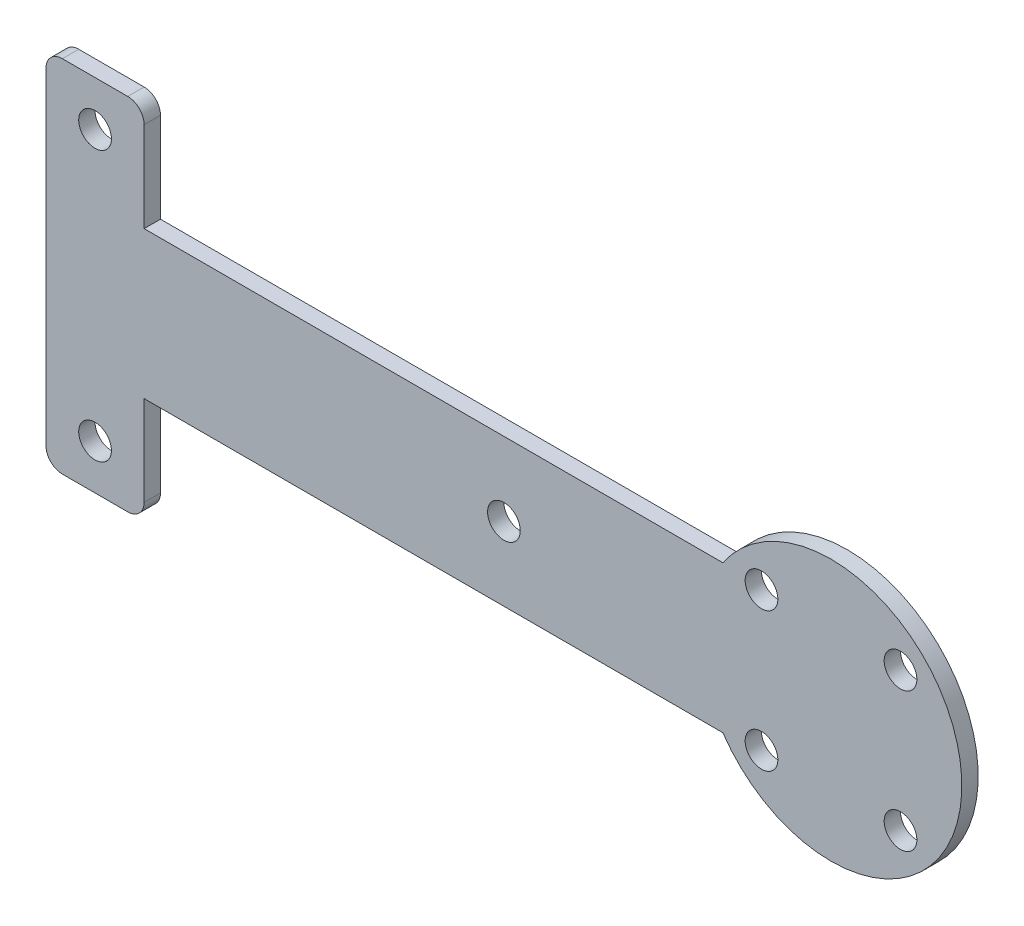
ISO-10303-21;
HEADER;
FILE_DESCRIPTION(('STEP AP214'),'2;1');
FILE_NAME('part.step','',(''),(''),'','','');
FILE_SCHEMA(('AUTOMOTIVE_DESIGN { 1 0 10303 214 1 1 1 1 }'));
ENDSEC;
DATA;
#1=APPLICATION_CONTEXT('core data for automotive mechanical design processes');
#2=APPLICATION_PROTOCOL_DEFINITION('international standard','automotive_design',2000,#1);
#3=PRODUCT_CONTEXT('',#1,'mechanical');
#4=PRODUCT('Part','Part','',(#3));
#5=PRODUCT_RELATED_PRODUCT_CATEGORY('part','',(#4));
#6=PRODUCT_DEFINITION_FORMATION('','',#4);
#7=PRODUCT_DEFINITION_CONTEXT('part definition',#1,'design');
#8=PRODUCT_DEFINITION('design','',#6,#7);
#9=PRODUCT_DEFINITION_SHAPE('','',#8);
#10=(LENGTH_UNIT() NAMED_UNIT(*) SI_UNIT(.MILLI.,.METRE.));
#11=(NAMED_UNIT(*) PLANE_ANGLE_UNIT() SI_UNIT($,.RADIAN.));
#12=(NAMED_UNIT(*) SI_UNIT($,.STERADIAN.) SOLID_ANGLE_UNIT());
#13=UNCERTAINTY_MEASURE_WITH_UNIT(LENGTH_MEASURE(1.E-05),#10,'distance_accuracy_value','');
#14=(GEOMETRIC_REPRESENTATION_CONTEXT(3) GLOBAL_UNCERTAINTY_ASSIGNED_CONTEXT((#13)) GLOBAL_UNIT_ASSIGNED_CONTEXT((#10,
#11,#12)) REPRESENTATION_CONTEXT('',''));
#15=CARTESIAN_POINT('',(0.,0.,0.));
#16=DIRECTION('',(0.,0.,1.));
#17=DIRECTION('',(1.,0.,0.));
#18=AXIS2_PLACEMENT_3D('',#15,#16,#17);
#19=CARTESIAN_POINT('',(41.2764285714286,0.145714285714315,2.));
#20=DIRECTION('',(0.,0.,-1.));
#21=DIRECTION('',(-1.,0.,0.));
#22=AXIS2_PLACEMENT_3D('',#19,#20,#21);
#23=CYLINDRICAL_SURFACE('',#22,16.);
#24=CARTESIAN_POINT('',(41.2764285714286,0.145714285714315,0.));
#25=DIRECTION('',(0.,0.,1.));
#26=DIRECTION('',(1.,0.,0.));
#27=AXIS2_PLACEMENT_3D('',#24,#25,#26);
#28=CIRCLE('',#27,16.);
#29=CARTESIAN_POINT('',(28.0476720161056,9.14571428571431,0.));
#30=VERTEX_POINT('',#29);
#31=CARTESIAN_POINT('',(28.0476720161057,-8.8542857142857,0.));
#32=VERTEX_POINT('',#31);
#33=EDGE_CURVE('E132',#30,#32,#28,.F.);
#34=ORIENTED_EDGE('',*,*,#33,.F.);
#35=DIRECTION('',(0.,0.,-1.));
#36=VECTOR('',#35,1.);
#37=CARTESIAN_POINT('',(28.0476720161056,9.14571428571431,2.));
#38=LINE('',#37,#36);
#39=CARTESIAN_POINT('',(28.0476720161056,9.14571428571431,2.));
#40=VERTEX_POINT('',#39);
#41=EDGE_CURVE('E128',#40,#30,#38,.T.);
#42=ORIENTED_EDGE('',*,*,#41,.F.);
#43=CARTESIAN_POINT('',(41.2764285714286,0.145714285714315,2.));
#44=DIRECTION('',(0.,0.,1.));
#45=DIRECTION('',(1.,0.,0.));
#46=AXIS2_PLACEMENT_3D('',#43,#44,#45);
#47=CIRCLE('',#46,16.);
#48=CARTESIAN_POINT('',(28.0476720161057,-8.8542857142857,2.));
#49=VERTEX_POINT('',#48);
#50=EDGE_CURVE('E130',#40,#49,#47,.F.);
#51=ORIENTED_EDGE('',*,*,#50,.T.);
#52=DIRECTION('',(0.,0.,-1.));
#53=VECTOR('',#52,1.);
#54=CARTESIAN_POINT('',(28.0476720161057,-8.8542857142857,2.));
#55=LINE('',#54,#53);
#56=EDGE_CURVE('E188',#49,#32,#55,.T.);
#57=ORIENTED_EDGE('',*,*,#56,.T.);
#58=EDGE_LOOP('',(#34,#42,#51,#57));
#59=FACE_BOUND('',#58,.T.);
#60=ADVANCED_FACE('F39',(#59),#23,.T.);
#61=CARTESIAN_POINT('',(0.,9.14571428571431,2.));
#62=DIRECTION('',(0.,1.,0.));
#63=DIRECTION('',(0.,0.,1.));
#64=AXIS2_PLACEMENT_3D('',#61,#62,#63);
#65=PLANE('',#64);
#66=DIRECTION('',(1.,0.,0.));
#67=VECTOR('',#66,1.);
#68=CARTESIAN_POINT('',(0.,9.14571428571431,0.));
#69=LINE('',#68,#67);
#70=CARTESIAN_POINT('',(-42.7235714285714,9.14571428571431,0.));
#71=VERTEX_POINT('',#70);
#72=EDGE_CURVE('E190',#71,#30,#69,.T.);
#73=ORIENTED_EDGE('',*,*,#72,.F.);
#74=DIRECTION('',(0.,0.,-1.));
#75=VECTOR('',#74,1.);
#76=CARTESIAN_POINT('',(-42.7235714285714,9.14571428571431,2.));
#77=LINE('',#76,#75);
#78=CARTESIAN_POINT('',(-42.7235714285714,9.14571428571431,2.));
#79=VERTEX_POINT('',#78);
#80=EDGE_CURVE('E138',#79,#71,#77,.T.);
#81=ORIENTED_EDGE('',*,*,#80,.F.);
#82=DIRECTION('',(1.,0.,0.));
#83=VECTOR('',#82,1.);
#84=CARTESIAN_POINT('',(0.,9.14571428571431,2.));
#85=LINE('',#84,#83);
#86=EDGE_CURVE('E144',#79,#40,#85,.T.);
#87=ORIENTED_EDGE('',*,*,#86,.T.);
#88=ORIENTED_EDGE('',*,*,#41,.T.);
#89=EDGE_LOOP('',(#73,#81,#87,#88));
#90=FACE_BOUND('',#89,.T.);
#91=ADVANCED_FACE('F150',(#90),#65,.T.);
#92=CARTESIAN_POINT('',(-42.7235714285714,0.,2.));
#93=DIRECTION('',(-1.,0.,0.));
#94=DIRECTION('',(0.,0.,1.));
#95=AXIS2_PLACEMENT_3D('',#92,#93,#94);
#96=PLANE('',#95);
#97=DIRECTION('',(0.,1.,0.));
#98=VECTOR('',#97,1.);
#99=CARTESIAN_POINT('',(-42.7235714285714,0.,0.));
#100=LINE('',#99,#98);
#101=CARTESIAN_POINT('',(-42.7235714285714,20.1457142857143,0.));
#102=VERTEX_POINT('',#101);
#103=EDGE_CURVE('E192',#71,#102,#100,.T.);
#104=ORIENTED_EDGE('',*,*,#103,.T.);
#105=DIRECTION('',(0.,0.,-1.));
#106=VECTOR('',#105,1.);
#107=CARTESIAN_POINT('',(-42.7235714285714,20.1457142857143,2.));
#108=LINE('',#107,#106);
#109=CARTESIAN_POINT('',(-42.7235714285714,20.1457142857143,2.));
#110=VERTEX_POINT('',#109);
#111=EDGE_CURVE('E245',#102,#110,#108,.F.);
#112=ORIENTED_EDGE('',*,*,#111,.T.);
#113=DIRECTION('',(0.,1.,0.));
#114=VECTOR('',#113,1.);
#115=CARTESIAN_POINT('',(-42.7235714285714,0.,2.));
#116=LINE('',#115,#114);
#117=EDGE_CURVE('E152',#79,#110,#116,.T.);
#118=ORIENTED_EDGE('',*,*,#117,.F.);
#119=ORIENTED_EDGE('',*,*,#80,.T.);
#120=EDGE_LOOP('',(#104,#112,#118,#119));
#121=FACE_BOUND('',#120,.T.);
#122=ADVANCED_FACE('F285',(#121),#96,.F.);
#123=CARTESIAN_POINT('',(0.,22.1457142857143,2.));
#124=DIRECTION('',(0.,-1.,0.));
#125=DIRECTION('',(0.,0.,-1.));
#126=AXIS2_PLACEMENT_3D('',#123,#124,#125);
#127=PLANE('',#126);
#128=DIRECTION('',(-1.,0.,0.));
#129=VECTOR('',#128,1.);
#130=CARTESIAN_POINT('',(0.,22.1457142857143,2.));
#131=LINE('',#130,#129);
#132=CARTESIAN_POINT('',(-44.7235714285714,22.1457142857143,2.));
#133=VERTEX_POINT('',#132);
#134=CARTESIAN_POINT('',(-52.7235714285714,22.1457142857143,2.));
#135=VERTEX_POINT('',#134);
#136=EDGE_CURVE('E154',#133,#135,#131,.T.);
#137=ORIENTED_EDGE('',*,*,#136,.F.);
#138=DIRECTION('',(0.,0.,-1.));
#139=VECTOR('',#138,1.);
#140=CARTESIAN_POINT('',(-44.7235714285714,22.1457142857143,2.));
#141=LINE('',#140,#139);
#142=CARTESIAN_POINT('',(-44.7235714285714,22.1457142857143,0.));
#143=VERTEX_POINT('',#142);
#144=EDGE_CURVE('E234',#133,#143,#141,.T.);
#145=ORIENTED_EDGE('',*,*,#144,.T.);
#146=DIRECTION('',(-1.,0.,0.));
#147=VECTOR('',#146,1.);
#148=CARTESIAN_POINT('',(0.,22.1457142857143,0.));
#149=LINE('',#148,#147);
#150=CARTESIAN_POINT('',(-52.7235714285714,22.1457142857143,0.));
#151=VERTEX_POINT('',#150);
#152=EDGE_CURVE('E195',#143,#151,#149,.T.);
#153=ORIENTED_EDGE('',*,*,#152,.T.);
#154=DIRECTION('',(0.,0.,-1.));
#155=VECTOR('',#154,1.);
#156=CARTESIAN_POINT('',(-52.7235714285714,22.1457142857143,2.));
#157=LINE('',#156,#155);
#158=EDGE_CURVE('E137',#151,#135,#157,.F.);
#159=ORIENTED_EDGE('',*,*,#158,.T.);
#160=EDGE_LOOP('',(#137,#145,#153,#159));
#161=FACE_BOUND('',#160,.T.);
#162=ADVANCED_FACE('F293',(#161),#127,.F.);
#163=CARTESIAN_POINT('',(-54.7235714285714,0.,2.));
#164=DIRECTION('',(1.,0.,0.));
#165=DIRECTION('',(0.,0.,-1.));
#166=AXIS2_PLACEMENT_3D('',#163,#164,#165);
#167=PLANE('',#166);
#168=DIRECTION('',(0.,-1.,0.));
#169=VECTOR('',#168,1.);
#170=CARTESIAN_POINT('',(-54.7235714285714,0.,2.));
#171=LINE('',#170,#169);
#172=CARTESIAN_POINT('',(-54.7235714285714,20.1457142857143,2.));
#173=VERTEX_POINT('',#172);
#174=CARTESIAN_POINT('',(-54.7235714285714,-19.8542857142857,2.));
#175=VERTEX_POINT('',#174);
#176=EDGE_CURVE('E159',#173,#175,#171,.T.);
#177=ORIENTED_EDGE('',*,*,#176,.F.);
#178=DIRECTION('',(0.,0.,-1.));
#179=VECTOR('',#178,1.);
#180=CARTESIAN_POINT('',(-54.7235714285714,20.1457142857143,2.));
#181=LINE('',#180,#179);
#182=CARTESIAN_POINT('',(-54.7235714285714,20.1457142857143,0.));
#183=VERTEX_POINT('',#182);
#184=EDGE_CURVE('E256',#173,#183,#181,.T.);
#185=ORIENTED_EDGE('',*,*,#184,.T.);
#186=DIRECTION('',(0.,-1.,0.));
#187=VECTOR('',#186,1.);
#188=CARTESIAN_POINT('',(-54.7235714285714,0.,0.));
#189=LINE('',#188,#187);
#190=CARTESIAN_POINT('',(-54.7235714285714,-19.8542857142857,0.));
#191=VERTEX_POINT('',#190);
#192=EDGE_CURVE('E198',#183,#191,#189,.T.);
#193=ORIENTED_EDGE('',*,*,#192,.T.);
#194=DIRECTION('',(0.,0.,-1.));
#195=VECTOR('',#194,1.);
#196=CARTESIAN_POINT('',(-54.7235714285714,-19.8542857142857,2.));
#197=LINE('',#196,#195);
#198=EDGE_CURVE('E254',#191,#175,#197,.F.);
#199=ORIENTED_EDGE('',*,*,#198,.T.);
#200=EDGE_LOOP('',(#177,#185,#193,#199));
#201=FACE_BOUND('',#200,.T.);
#202=ADVANCED_FACE('F300',(#201),#167,.F.);
#203=CARTESIAN_POINT('',(0.,-21.8542857142857,2.));
#204=DIRECTION('',(0.,1.,0.));
#205=DIRECTION('',(0.,0.,1.));
#206=AXIS2_PLACEMENT_3D('',#203,#204,#205);
#207=PLANE('',#206);
#208=DIRECTION('',(1.,0.,0.));
#209=VECTOR('',#208,1.);
#210=CARTESIAN_POINT('',(0.,-21.8542857142857,0.));
#211=LINE('',#210,#209);
#212=CARTESIAN_POINT('',(-52.7235714285714,-21.8542857142857,0.));
#213=VERTEX_POINT('',#212);
#214=CARTESIAN_POINT('',(-44.7235714285714,-21.8542857142857,0.));
#215=VERTEX_POINT('',#214);
#216=EDGE_CURVE('E201',#213,#215,#211,.T.);
#217=ORIENTED_EDGE('',*,*,#216,.T.);
#218=DIRECTION('',(0.,0.,-1.));
#219=VECTOR('',#218,1.);
#220=CARTESIAN_POINT('',(-44.7235714285714,-21.8542857142857,2.));
#221=LINE('',#220,#219);
#222=CARTESIAN_POINT('',(-44.7235714285714,-21.8542857142857,2.));
#223=VERTEX_POINT('',#222);
#224=EDGE_CURVE('E11',#215,#223,#221,.F.);
#225=ORIENTED_EDGE('',*,*,#224,.T.);
#226=DIRECTION('',(1.,0.,0.));
#227=VECTOR('',#226,1.);
#228=CARTESIAN_POINT('',(0.,-21.8542857142857,2.));
#229=LINE('',#228,#227);
#230=CARTESIAN_POINT('',(-52.7235714285714,-21.8542857142857,2.));
#231=VERTEX_POINT('',#230);
#232=EDGE_CURVE('E162',#231,#223,#229,.T.);
#233=ORIENTED_EDGE('',*,*,#232,.F.);
#234=DIRECTION('',(0.,0.,-1.));
#235=VECTOR('',#234,1.);
#236=CARTESIAN_POINT('',(-52.7235714285714,-21.8542857142857,2.));
#237=LINE('',#236,#235);
#238=EDGE_CURVE('E47',#231,#213,#237,.T.);
#239=ORIENTED_EDGE('',*,*,#238,.T.);
#240=EDGE_LOOP('',(#217,#225,#233,#239));
#241=FACE_BOUND('',#240,.T.);
#242=ADVANCED_FACE('F264',(#241),#207,.F.);
#243=CARTESIAN_POINT('',(-42.7235714285714,0.,2.));
#244=DIRECTION('',(-1.,0.,0.));
#245=DIRECTION('',(0.,-1.,0.));
#246=AXIS2_PLACEMENT_3D('',#243,#244,#245);
#247=PLANE('',#246);
#248=DIRECTION('',(0.,1.,0.));
#249=VECTOR('',#248,1.);
#250=CARTESIAN_POINT('',(-42.7235714285714,0.,2.));
#251=LINE('',#250,#249);
#252=CARTESIAN_POINT('',(-42.7235714285714,-19.8542857142857,2.));
#253=VERTEX_POINT('',#252);
#254=CARTESIAN_POINT('',(-42.7235714285714,-8.8542857142857,2.));
#255=VERTEX_POINT('',#254);
#256=EDGE_CURVE('E164',#253,#255,#251,.T.);
#257=ORIENTED_EDGE('',*,*,#256,.F.);
#258=DIRECTION('',(0.,0.,-1.));
#259=VECTOR('',#258,1.);
#260=CARTESIAN_POINT('',(-42.7235714285714,-19.8542857142857,2.));
#261=LINE('',#260,#259);
#262=CARTESIAN_POINT('',(-42.7235714285714,-19.8542857142857,0.));
#263=VERTEX_POINT('',#262);
#264=EDGE_CURVE('E259',#253,#263,#261,.T.);
#265=ORIENTED_EDGE('',*,*,#264,.T.);
#266=DIRECTION('',(0.,1.,0.));
#267=VECTOR('',#266,1.);
#268=CARTESIAN_POINT('',(-42.7235714285714,0.,0.));
#269=LINE('',#268,#267);
#270=CARTESIAN_POINT('',(-42.7235714285714,-8.8542857142857,0.));
#271=VERTEX_POINT('',#270);
#272=EDGE_CURVE('E203',#263,#271,#269,.T.);
#273=ORIENTED_EDGE('',*,*,#272,.T.);
#274=DIRECTION('',(0.,0.,-1.));
#275=VECTOR('',#274,1.);
#276=CARTESIAN_POINT('',(-42.7235714285714,-8.8542857142857,2.));
#277=LINE('',#276,#275);
#278=EDGE_CURVE('E229',#255,#271,#277,.T.);
#279=ORIENTED_EDGE('',*,*,#278,.F.);
#280=EDGE_LOOP('',(#257,#265,#273,#279));
#281=FACE_BOUND('',#280,.T.);
#282=ADVANCED_FACE('F278',(#281),#247,.F.);
#283=CARTESIAN_POINT('',(-48.7235714285714,16.6457142857143,2.));
#284=DIRECTION('',(0.,0.,-1.));
#285=DIRECTION('',(-1.,0.,0.));
#286=AXIS2_PLACEMENT_3D('',#283,#284,#285);
#287=CYLINDRICAL_SURFACE('',#286,2.);
#288=CARTESIAN_POINT('',(-48.7235714285714,16.6457142857143,2.));
#289=DIRECTION('',(0.,0.,1.));
#290=DIRECTION('',(1.,0.,0.));
#291=AXIS2_PLACEMENT_3D('',#288,#289,#290);
#292=CIRCLE('',#291,2.);
#293=CARTESIAN_POINT('',(-46.7235714285714,16.6457142857143,2.));
#294=VERTEX_POINT('',#293);
#295=EDGE_CURVE('E182',#294,#294,#292,.T.);
#296=ORIENTED_EDGE('',*,*,#295,.T.);
#297=EDGE_LOOP('',(#296));
#298=FACE_BOUND('',#297,.T.);
#299=CARTESIAN_POINT('',(-48.7235714285714,16.6457142857143,0.));
#300=DIRECTION('',(0.,0.,1.));
#301=DIRECTION('',(1.,0.,0.));
#302=AXIS2_PLACEMENT_3D('',#299,#300,#301);
#303=CIRCLE('',#302,2.);
#304=CARTESIAN_POINT('',(-46.7235714285714,16.6457142857143,0.));
#305=VERTEX_POINT('',#304);
#306=EDGE_CURVE('E223',#305,#305,#303,.T.);
#307=ORIENTED_EDGE('',*,*,#306,.F.);
#308=EDGE_LOOP('',(#307));
#309=FACE_BOUND('',#308,.T.);
#310=ADVANCED_FACE('F414',(#298,#309),#287,.F.);
#311=CARTESIAN_POINT('',(1.27642857142862,0.145714285714315,2.));
#312=DIRECTION('',(0.,0.,-1.));
#313=DIRECTION('',(-1.,0.,0.));
#314=AXIS2_PLACEMENT_3D('',#311,#312,#313);
#315=CYLINDRICAL_SURFACE('',#314,2.);
#316=CARTESIAN_POINT('',(1.27642857142862,0.145714285714315,2.));
#317=DIRECTION('',(0.,0.,1.));
#318=DIRECTION('',(1.,0.,0.));
#319=AXIS2_PLACEMENT_3D('',#316,#317,#318);
#320=CIRCLE('',#319,2.);
#321=CARTESIAN_POINT('',(3.27642857142862,0.145714285714315,2.));
#322=VERTEX_POINT('',#321);
#323=EDGE_CURVE('E179',#322,#322,#320,.T.);
#324=ORIENTED_EDGE('',*,*,#323,.T.);
#325=EDGE_LOOP('',(#324));
#326=FACE_BOUND('',#325,.T.);
#327=CARTESIAN_POINT('',(1.27642857142862,0.145714285714315,0.));
#328=DIRECTION('',(0.,0.,1.));
#329=DIRECTION('',(1.,0.,0.));
#330=AXIS2_PLACEMENT_3D('',#327,#328,#329);
#331=CIRCLE('',#330,2.);
#332=CARTESIAN_POINT('',(3.27642857142862,0.145714285714315,0.));
#333=VERTEX_POINT('',#332);
#334=EDGE_CURVE('E220',#333,#333,#331,.T.);
#335=ORIENTED_EDGE('',*,*,#334,.F.);
#336=EDGE_LOOP('',(#335));
#337=FACE_BOUND('',#336,.T.);
#338=ADVANCED_FACE('F405',(#326,#337),#315,.F.);
#339=CARTESIAN_POINT('',(49.7764285714286,-8.35428571428569,2.));
#340=DIRECTION('',(0.,0.,-1.));
#341=DIRECTION('',(-1.,0.,0.));
#342=AXIS2_PLACEMENT_3D('',#339,#340,#341);
#343=CYLINDRICAL_SURFACE('',#342,2.);
#344=CARTESIAN_POINT('',(49.7764285714286,-8.35428571428569,2.));
#345=DIRECTION('',(0.,0.,1.));
#346=DIRECTION('',(1.,0.,0.));
#347=AXIS2_PLACEMENT_3D('',#344,#345,#346);
#348=CIRCLE('',#347,2.);
#349=CARTESIAN_POINT('',(51.7764285714286,-8.35428571428569,2.));
#350=VERTEX_POINT('',#349);
#351=EDGE_CURVE('E176',#350,#350,#348,.T.);
#352=ORIENTED_EDGE('',*,*,#351,.T.);
#353=EDGE_LOOP('',(#352));
#354=FACE_BOUND('',#353,.T.);
#355=CARTESIAN_POINT('',(49.7764285714286,-8.35428571428569,0.));
#356=DIRECTION('',(0.,0.,1.));
#357=DIRECTION('',(1.,0.,0.));
#358=AXIS2_PLACEMENT_3D('',#355,#356,#357);
#359=CIRCLE('',#358,2.);
#360=CARTESIAN_POINT('',(51.7764285714286,-8.35428571428569,0.));
#361=VERTEX_POINT('',#360);
#362=EDGE_CURVE('E217',#361,#361,#359,.T.);
#363=ORIENTED_EDGE('',*,*,#362,.F.);
#364=EDGE_LOOP('',(#363));
#365=FACE_BOUND('',#364,.T.);
#366=ADVANCED_FACE('F396',(#354,#365),#343,.F.);
#367=CARTESIAN_POINT('',(32.7764285714286,-8.35428571428565,2.));
#368=DIRECTION('',(0.,0.,-1.));
#369=DIRECTION('',(-1.,0.,0.));
#370=AXIS2_PLACEMENT_3D('',#367,#368,#369);
#371=CYLINDRICAL_SURFACE('',#370,2.);
#372=CARTESIAN_POINT('',(32.7764285714286,-8.35428571428565,2.));
#373=DIRECTION('',(0.,0.,1.));
#374=DIRECTION('',(1.,0.,0.));
#375=AXIS2_PLACEMENT_3D('',#372,#373,#374);
#376=CIRCLE('',#375,2.);
#377=CARTESIAN_POINT('',(34.7764285714286,-8.35428571428565,2.));
#378=VERTEX_POINT('',#377);
#379=EDGE_CURVE('E173',#378,#378,#376,.T.);
#380=ORIENTED_EDGE('',*,*,#379,.T.);
#381=EDGE_LOOP('',(#380));
#382=FACE_BOUND('',#381,.T.);
#383=CARTESIAN_POINT('',(32.7764285714286,-8.35428571428565,0.));
#384=DIRECTION('',(0.,0.,1.));
#385=DIRECTION('',(1.,0.,0.));
#386=AXIS2_PLACEMENT_3D('',#383,#384,#385);
#387=CIRCLE('',#386,2.);
#388=CARTESIAN_POINT('',(34.7764285714286,-8.35428571428565,0.));
#389=VERTEX_POINT('',#388);
#390=EDGE_CURVE('E214',#389,#389,#387,.T.);
#391=ORIENTED_EDGE('',*,*,#390,.F.);
#392=EDGE_LOOP('',(#391));
#393=FACE_BOUND('',#392,.T.);
#394=ADVANCED_FACE('F387',(#382,#393),#371,.F.);
#395=CARTESIAN_POINT('',(32.7764285714287,8.64571428571437,2.));
#396=DIRECTION('',(0.,0.,-1.));
#397=DIRECTION('',(-1.,0.,0.));
#398=AXIS2_PLACEMENT_3D('',#395,#396,#397);
#399=CYLINDRICAL_SURFACE('',#398,2.);
#400=CARTESIAN_POINT('',(32.7764285714287,8.64571428571437,2.));
#401=DIRECTION('',(0.,0.,1.));
#402=DIRECTION('',(1.,0.,0.));
#403=AXIS2_PLACEMENT_3D('',#400,#401,#402);
#404=CIRCLE('',#403,2.);
#405=CARTESIAN_POINT('',(34.7764285714287,8.64571428571437,2.));
#406=VERTEX_POINT('',#405);
#407=EDGE_CURVE('E170',#406,#406,#404,.T.);
#408=ORIENTED_EDGE('',*,*,#407,.T.);
#409=EDGE_LOOP('',(#408));
#410=FACE_BOUND('',#409,.T.);
#411=CARTESIAN_POINT('',(32.7764285714287,8.64571428571437,0.));
#412=DIRECTION('',(0.,0.,1.));
#413=DIRECTION('',(1.,0.,0.));
#414=AXIS2_PLACEMENT_3D('',#411,#412,#413);
#415=CIRCLE('',#414,2.);
#416=CARTESIAN_POINT('',(34.7764285714287,8.64571428571437,0.));
#417=VERTEX_POINT('',#416);
#418=EDGE_CURVE('E211',#417,#417,#415,.T.);
#419=ORIENTED_EDGE('',*,*,#418,.F.);
#420=EDGE_LOOP('',(#419));
#421=FACE_BOUND('',#420,.T.);
#422=ADVANCED_FACE('F378',(#410,#421),#399,.F.);
#423=CARTESIAN_POINT('',(49.7764285714287,8.64571428571422,2.));
#424=DIRECTION('',(0.,0.,-1.));
#425=DIRECTION('',(-1.,0.,0.));
#426=AXIS2_PLACEMENT_3D('',#423,#424,#425);
#427=CYLINDRICAL_SURFACE('',#426,2.);
#428=CARTESIAN_POINT('',(49.7764285714287,8.64571428571422,2.));
#429=DIRECTION('',(0.,0.,1.));
#430=DIRECTION('',(1.,0.,0.));
#431=AXIS2_PLACEMENT_3D('',#428,#429,#430);
#432=CIRCLE('',#431,2.);
#433=CARTESIAN_POINT('',(51.7764285714287,8.64571428571422,2.));
#434=VERTEX_POINT('',#433);
#435=EDGE_CURVE('E167',#434,#434,#432,.T.);
#436=ORIENTED_EDGE('',*,*,#435,.T.);
#437=EDGE_LOOP('',(#436));
#438=FACE_BOUND('',#437,.T.);
#439=CARTESIAN_POINT('',(49.7764285714287,8.64571428571422,0.));
#440=DIRECTION('',(0.,0.,1.));
#441=DIRECTION('',(1.,0.,0.));
#442=AXIS2_PLACEMENT_3D('',#439,#440,#441);
#443=CIRCLE('',#442,2.);
#444=CARTESIAN_POINT('',(51.7764285714287,8.64571428571422,0.));
#445=VERTEX_POINT('',#444);
#446=EDGE_CURVE('E208',#445,#445,#443,.T.);
#447=ORIENTED_EDGE('',*,*,#446,.F.);
#448=EDGE_LOOP('',(#447));
#449=FACE_BOUND('',#448,.T.);
#450=ADVANCED_FACE('F370',(#438,#449),#427,.F.);
#451=CARTESIAN_POINT('',(0.,-8.8542857142857,2.));
#452=DIRECTION('',(0.,1.,0.));
#453=DIRECTION('',(0.,0.,1.));
#454=AXIS2_PLACEMENT_3D('',#451,#452,#453);
#455=PLANE('',#454);
#456=DIRECTION('',(1.,0.,0.));
#457=VECTOR('',#456,1.);
#458=CARTESIAN_POINT('',(0.,-8.8542857142857,0.));
#459=LINE('',#458,#457);
#460=EDGE_CURVE('E205',#271,#32,#459,.T.);
#461=ORIENTED_EDGE('',*,*,#460,.T.);
#462=ORIENTED_EDGE('',*,*,#56,.F.);
#463=DIRECTION('',(1.,0.,0.));
#464=VECTOR('',#463,1.);
#465=CARTESIAN_POINT('',(0.,-8.8542857142857,2.));
#466=LINE('',#465,#464);
#467=EDGE_CURVE('E146',#255,#49,#466,.T.);
#468=ORIENTED_EDGE('',*,*,#467,.F.);
#469=ORIENTED_EDGE('',*,*,#278,.T.);
#470=EDGE_LOOP('',(#461,#462,#468,#469));
#471=FACE_BOUND('',#470,.T.);
#472=ADVANCED_FACE('F281',(#471),#455,.F.);
#473=CARTESIAN_POINT('',(-48.7235714285714,-16.3542857142857,2.));
#474=DIRECTION('',(0.,0.,-1.));
#475=DIRECTION('',(-1.,0.,0.));
#476=AXIS2_PLACEMENT_3D('',#473,#474,#475);
#477=CYLINDRICAL_SURFACE('',#476,2.);
#478=CARTESIAN_POINT('',(-48.7235714285714,-16.3542857142857,2.));
#479=DIRECTION('',(0.,0.,1.));
#480=DIRECTION('',(1.,0.,0.));
#481=AXIS2_PLACEMENT_3D('',#478,#479,#480);
#482=CIRCLE('',#481,2.);
#483=CARTESIAN_POINT('',(-46.7235714285714,-16.3542857142857,2.));
#484=VERTEX_POINT('',#483);
#485=EDGE_CURVE('E185',#484,#484,#482,.F.);
#486=ORIENTED_EDGE('',*,*,#485,.F.);
#487=EDGE_LOOP('',(#486));
#488=FACE_BOUND('',#487,.T.);
#489=CARTESIAN_POINT('',(-48.7235714285714,-16.3542857142857,0.));
#490=DIRECTION('',(0.,0.,1.));
#491=DIRECTION('',(1.,0.,0.));
#492=AXIS2_PLACEMENT_3D('',#489,#490,#491);
#493=CIRCLE('',#492,2.);
#494=CARTESIAN_POINT('',(-46.7235714285714,-16.3542857142857,0.));
#495=VERTEX_POINT('',#494);
#496=EDGE_CURVE('E148',#495,#495,#493,.F.);
#497=ORIENTED_EDGE('',*,*,#496,.T.);
#498=EDGE_LOOP('',(#497));
#499=FACE_BOUND('',#498,.T.);
#500=ADVANCED_FACE('F352',(#488,#499),#477,.F.);
#501=CARTESIAN_POINT('',(0.,0.,2.));
#502=DIRECTION('',(0.,0.,1.));
#503=DIRECTION('',(1.,0.,0.));
#504=AXIS2_PLACEMENT_3D('',#501,#502,#503);
#505=PLANE('',#504);
#506=ORIENTED_EDGE('',*,*,#117,.T.);
#507=CARTESIAN_POINT('',(-44.7235714285714,20.1457142857143,2.));
#508=DIRECTION('',(0.,0.,1.));
#509=DIRECTION('',(1.,0.,0.));
#510=AXIS2_PLACEMENT_3D('',#507,#508,#509);
#511=CIRCLE('',#510,2.);
#512=EDGE_CURVE('E252',#110,#133,#511,.T.);
#513=ORIENTED_EDGE('',*,*,#512,.T.);
#514=ORIENTED_EDGE('',*,*,#136,.T.);
#515=CARTESIAN_POINT('',(-52.7235714285714,20.1457142857143,2.));
#516=DIRECTION('',(0.,0.,1.));
#517=DIRECTION('',(1.,0.,0.));
#518=AXIS2_PLACEMENT_3D('',#515,#516,#517);
#519=CIRCLE('',#518,2.);
#520=EDGE_CURVE('E250',#135,#173,#519,.T.);
#521=ORIENTED_EDGE('',*,*,#520,.T.);
#522=ORIENTED_EDGE('',*,*,#176,.T.);
#523=CARTESIAN_POINT('',(-52.7235714285714,-19.8542857142857,2.));
#524=DIRECTION('',(0.,0.,1.));
#525=DIRECTION('',(1.,0.,0.));
#526=AXIS2_PLACEMENT_3D('',#523,#524,#525);
#527=CIRCLE('',#526,2.);
#528=EDGE_CURVE('E247',#175,#231,#527,.T.);
#529=ORIENTED_EDGE('',*,*,#528,.T.);
#530=ORIENTED_EDGE('',*,*,#232,.T.);
#531=CARTESIAN_POINT('',(-44.7235714285714,-19.8542857142857,2.));
#532=DIRECTION('',(0.,0.,1.));
#533=DIRECTION('',(1.,0.,0.));
#534=AXIS2_PLACEMENT_3D('',#531,#532,#533);
#535=CIRCLE('',#534,2.);
#536=EDGE_CURVE('E54',#223,#253,#535,.T.);
#537=ORIENTED_EDGE('',*,*,#536,.T.);
#538=ORIENTED_EDGE('',*,*,#256,.T.);
#539=ORIENTED_EDGE('',*,*,#467,.T.);
#540=ORIENTED_EDGE('',*,*,#50,.F.);
#541=ORIENTED_EDGE('',*,*,#86,.F.);
#542=EDGE_LOOP('',(#506,#513,#514,#521,#522,#529,#530,#537,#538,#539,#540,#541));
#543=FACE_BOUND('',#542,.T.);
#544=ORIENTED_EDGE('',*,*,#435,.F.);
#545=EDGE_LOOP('',(#544));
#546=FACE_BOUND('',#545,.T.);
#547=ORIENTED_EDGE('',*,*,#407,.F.);
#548=EDGE_LOOP('',(#547));
#549=FACE_BOUND('',#548,.T.);
#550=ORIENTED_EDGE('',*,*,#379,.F.);
#551=EDGE_LOOP('',(#550));
#552=FACE_BOUND('',#551,.T.);
#553=ORIENTED_EDGE('',*,*,#351,.F.);
#554=EDGE_LOOP('',(#553));
#555=FACE_BOUND('',#554,.T.);
#556=ORIENTED_EDGE('',*,*,#323,.F.);
#557=EDGE_LOOP('',(#556));
#558=FACE_BOUND('',#557,.T.);
#559=ORIENTED_EDGE('',*,*,#295,.F.);
#560=EDGE_LOOP('',(#559));
#561=FACE_BOUND('',#560,.T.);
#562=ORIENTED_EDGE('',*,*,#485,.T.);
#563=EDGE_LOOP('',(#562));
#564=FACE_BOUND('',#563,.T.);
#565=ADVANCED_FACE('F142',(#543,#546,#549,#552,#555,#558,#561,#564),#505,.T.);
#566=CARTESIAN_POINT('',(0.,0.,0.));
#567=DIRECTION('',(0.,0.,1.));
#568=DIRECTION('',(1.,0.,0.));
#569=AXIS2_PLACEMENT_3D('',#566,#567,#568);
#570=PLANE('',#569);
#571=ORIENTED_EDGE('',*,*,#152,.F.);
#572=CARTESIAN_POINT('',(-44.7235714285714,20.1457142857143,0.));
#573=DIRECTION('',(0.,0.,1.));
#574=DIRECTION('',(1.,0.,0.));
#575=AXIS2_PLACEMENT_3D('',#572,#573,#574);
#576=CIRCLE('',#575,2.);
#577=EDGE_CURVE('E243',#143,#102,#576,.F.);
#578=ORIENTED_EDGE('',*,*,#577,.T.);
#579=ORIENTED_EDGE('',*,*,#103,.F.);
#580=ORIENTED_EDGE('',*,*,#72,.T.);
#581=ORIENTED_EDGE('',*,*,#33,.T.);
#582=ORIENTED_EDGE('',*,*,#460,.F.);
#583=ORIENTED_EDGE('',*,*,#272,.F.);
#584=CARTESIAN_POINT('',(-44.7235714285714,-19.8542857142857,0.));
#585=DIRECTION('',(0.,0.,1.));
#586=DIRECTION('',(1.,0.,0.));
#587=AXIS2_PLACEMENT_3D('',#584,#585,#586);
#588=CIRCLE('',#587,2.);
#589=EDGE_CURVE('E239',#263,#215,#588,.F.);
#590=ORIENTED_EDGE('',*,*,#589,.T.);
#591=ORIENTED_EDGE('',*,*,#216,.F.);
#592=CARTESIAN_POINT('',(-52.7235714285714,-19.8542857142857,0.));
#593=DIRECTION('',(0.,0.,1.));
#594=DIRECTION('',(1.,0.,0.));
#595=AXIS2_PLACEMENT_3D('',#592,#593,#594);
#596=CIRCLE('',#595,2.);
#597=EDGE_CURVE('E237',#213,#191,#596,.F.);
#598=ORIENTED_EDGE('',*,*,#597,.T.);
#599=ORIENTED_EDGE('',*,*,#192,.F.);
#600=CARTESIAN_POINT('',(-52.7235714285714,20.1457142857143,0.));
#601=DIRECTION('',(0.,0.,1.));
#602=DIRECTION('',(1.,0.,0.));
#603=AXIS2_PLACEMENT_3D('',#600,#601,#602);
#604=CIRCLE('',#603,2.);
#605=EDGE_CURVE('E241',#183,#151,#604,.F.);
#606=ORIENTED_EDGE('',*,*,#605,.T.);
#607=EDGE_LOOP('',(#571,#578,#579,#580,#581,#582,#583,#590,#591,#598,#599,#606));
#608=FACE_BOUND('',#607,.T.);
#609=ORIENTED_EDGE('',*,*,#446,.T.);
#610=EDGE_LOOP('',(#609));
#611=FACE_BOUND('',#610,.T.);
#612=ORIENTED_EDGE('',*,*,#418,.T.);
#613=EDGE_LOOP('',(#612));
#614=FACE_BOUND('',#613,.T.);
#615=ORIENTED_EDGE('',*,*,#390,.T.);
#616=EDGE_LOOP('',(#615));
#617=FACE_BOUND('',#616,.T.);
#618=ORIENTED_EDGE('',*,*,#362,.T.);
#619=EDGE_LOOP('',(#618));
#620=FACE_BOUND('',#619,.T.);
#621=ORIENTED_EDGE('',*,*,#334,.T.);
#622=EDGE_LOOP('',(#621));
#623=FACE_BOUND('',#622,.T.);
#624=ORIENTED_EDGE('',*,*,#306,.T.);
#625=EDGE_LOOP('',(#624));
#626=FACE_BOUND('',#625,.T.);
#627=ORIENTED_EDGE('',*,*,#496,.F.);
#628=EDGE_LOOP('',(#627));
#629=FACE_BOUND('',#628,.T.);
#630=ADVANCED_FACE('F269',(#608,#611,#614,#617,#620,#623,#626,#629),#570,.F.);
#631=CARTESIAN_POINT('',(-44.7235714285714,20.1457142857143,2.));
#632=DIRECTION('',(0.,0.,-1.));
#633=DIRECTION('',(-1.,0.,0.));
#634=AXIS2_PLACEMENT_3D('',#631,#632,#633);
#635=CYLINDRICAL_SURFACE('',#634,2.);
#636=ORIENTED_EDGE('',*,*,#512,.F.);
#637=ORIENTED_EDGE('',*,*,#111,.F.);
#638=ORIENTED_EDGE('',*,*,#577,.F.);
#639=ORIENTED_EDGE('',*,*,#144,.F.);
#640=EDGE_LOOP('',(#636,#637,#638,#639));
#641=FACE_BOUND('',#640,.T.);
#642=ADVANCED_FACE('F288',(#641),#635,.T.);
#643=CARTESIAN_POINT('',(-52.7235714285714,20.1457142857143,2.));
#644=DIRECTION('',(0.,0.,-1.));
#645=DIRECTION('',(-1.,0.,0.));
#646=AXIS2_PLACEMENT_3D('',#643,#644,#645);
#647=CYLINDRICAL_SURFACE('',#646,2.);
#648=ORIENTED_EDGE('',*,*,#520,.F.);
#649=ORIENTED_EDGE('',*,*,#158,.F.);
#650=ORIENTED_EDGE('',*,*,#605,.F.);
#651=ORIENTED_EDGE('',*,*,#184,.F.);
#652=EDGE_LOOP('',(#648,#649,#650,#651));
#653=FACE_BOUND('',#652,.T.);
#654=ADVANCED_FACE('F296',(#653),#647,.T.);
#655=CARTESIAN_POINT('',(-44.7235714285714,-19.8542857142857,2.));
#656=DIRECTION('',(0.,0.,-1.));
#657=DIRECTION('',(-1.,0.,0.));
#658=AXIS2_PLACEMENT_3D('',#655,#656,#657);
#659=CYLINDRICAL_SURFACE('',#658,2.);
#660=ORIENTED_EDGE('',*,*,#536,.F.);
#661=ORIENTED_EDGE('',*,*,#224,.F.);
#662=ORIENTED_EDGE('',*,*,#589,.F.);
#663=ORIENTED_EDGE('',*,*,#264,.F.);
#664=EDGE_LOOP('',(#660,#661,#662,#663));
#665=FACE_BOUND('',#664,.T.);
#666=ADVANCED_FACE('F276',(#665),#659,.T.);
#667=CARTESIAN_POINT('',(-52.7235714285714,-19.8542857142857,2.));
#668=DIRECTION('',(0.,0.,-1.));
#669=DIRECTION('',(-1.,0.,0.));
#670=AXIS2_PLACEMENT_3D('',#667,#668,#669);
#671=CYLINDRICAL_SURFACE('',#670,2.);
#672=ORIENTED_EDGE('',*,*,#528,.F.);
#673=ORIENTED_EDGE('',*,*,#198,.F.);
#674=ORIENTED_EDGE('',*,*,#597,.F.);
#675=ORIENTED_EDGE('',*,*,#238,.F.);
#676=EDGE_LOOP('',(#672,#673,#674,#675));
#677=FACE_BOUND('',#676,.T.);
#678=ADVANCED_FACE('F41',(#677),#671,.T.);
#679=CLOSED_SHELL('',(#60,#91,#122,#162,#202,#242,#282,#310,#338,#366,#394,#422,#450,#472,#500,
#565,#630,#642,#654,#666,#678));
#680=MANIFOLD_SOLID_BREP('B2',#679);
#681=ADVANCED_BREP_SHAPE_REPRESENTATION('',(#18,#680),#14);
#682=SHAPE_DEFINITION_REPRESENTATION(#9,#681);
ENDSEC;
END-ISO-10303-21;
